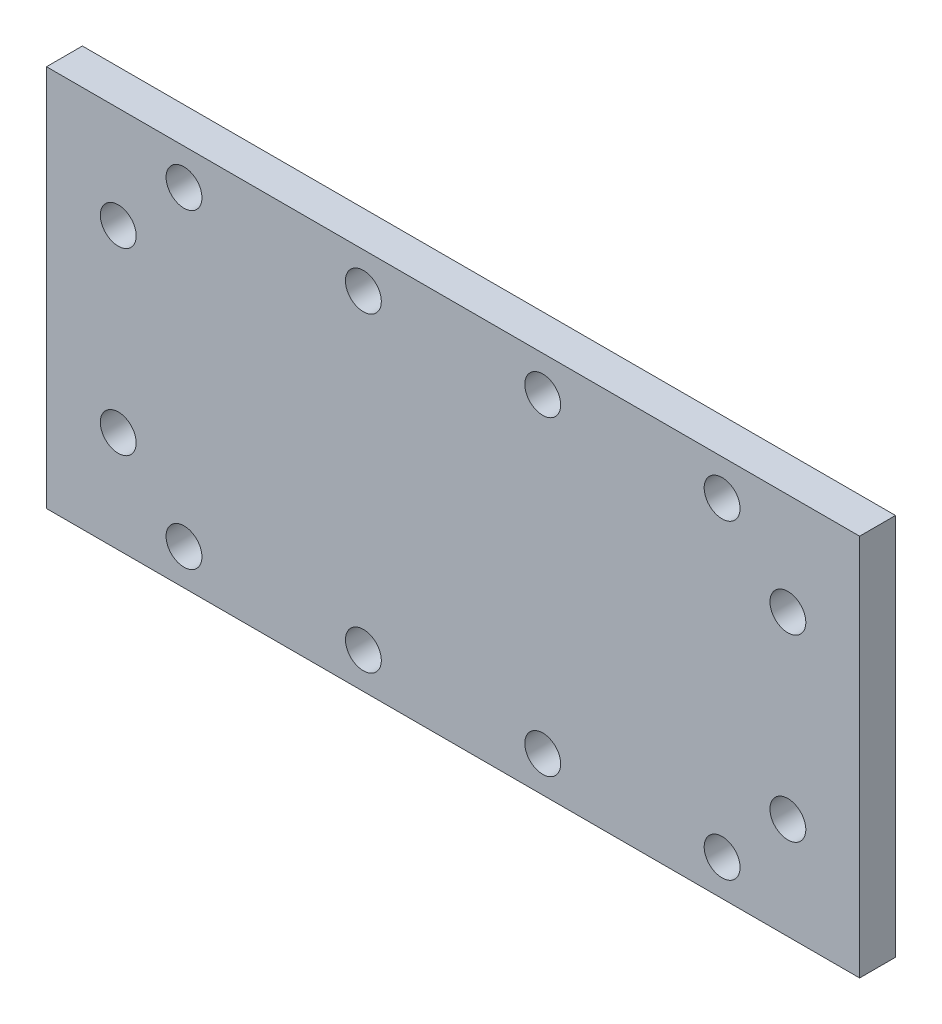
ISO-10303-21;
HEADER;
FILE_DESCRIPTION(('STEP AP214'),'2;1');
FILE_NAME('part.step','',(''),(''),'','','');
FILE_SCHEMA(('AUTOMOTIVE_DESIGN { 1 0 10303 214 1 1 1 1 }'));
ENDSEC;
DATA;
#1=APPLICATION_CONTEXT('core data for automotive mechanical design processes');
#2=APPLICATION_PROTOCOL_DEFINITION('international standard','automotive_design',2000,#1);
#3=PRODUCT_CONTEXT('',#1,'mechanical');
#4=PRODUCT('Part','Part','',(#3));
#5=PRODUCT_RELATED_PRODUCT_CATEGORY('part','',(#4));
#6=PRODUCT_DEFINITION_FORMATION('','',#4);
#7=PRODUCT_DEFINITION_CONTEXT('part definition',#1,'design');
#8=PRODUCT_DEFINITION('design','',#6,#7);
#9=PRODUCT_DEFINITION_SHAPE('','',#8);
#10=(LENGTH_UNIT() NAMED_UNIT(*) SI_UNIT(.MILLI.,.METRE.));
#11=(NAMED_UNIT(*) PLANE_ANGLE_UNIT() SI_UNIT($,.RADIAN.));
#12=(NAMED_UNIT(*) SI_UNIT($,.STERADIAN.) SOLID_ANGLE_UNIT());
#13=UNCERTAINTY_MEASURE_WITH_UNIT(LENGTH_MEASURE(1.E-05),#10,'distance_accuracy_value','');
#14=(GEOMETRIC_REPRESENTATION_CONTEXT(3) GLOBAL_UNCERTAINTY_ASSIGNED_CONTEXT((#13)) GLOBAL_UNIT_ASSIGNED_CONTEXT((#10,
#11,#12)) REPRESENTATION_CONTEXT('',''));
#15=CARTESIAN_POINT('',(0.,0.,0.));
#16=DIRECTION('',(0.,0.,1.));
#17=DIRECTION('',(1.,0.,0.));
#18=AXIS2_PLACEMENT_3D('',#15,#16,#17);
#19=CARTESIAN_POINT('',(-34.,-16.,3.));
#20=DIRECTION('',(1.,0.,0.));
#21=DIRECTION('',(0.,0.,-1.));
#22=AXIS2_PLACEMENT_3D('',#19,#20,#21);
#23=PLANE('',#22);
#24=DIRECTION('',(0.,-1.,0.));
#25=VECTOR('',#24,1.);
#26=CARTESIAN_POINT('',(-34.,-16.,0.));
#27=LINE('',#26,#25);
#28=CARTESIAN_POINT('',(-34.,16.,0.));
#29=VERTEX_POINT('',#28);
#30=CARTESIAN_POINT('',(-34.,-16.,0.));
#31=VERTEX_POINT('',#30);
#32=EDGE_CURVE('E111',#29,#31,#27,.T.);
#33=ORIENTED_EDGE('',*,*,#32,.T.);
#34=DIRECTION('',(0.,0.,-1.));
#35=VECTOR('',#34,1.);
#36=CARTESIAN_POINT('',(-34.,-16.,3.));
#37=LINE('',#36,#35);
#38=CARTESIAN_POINT('',(-34.,-16.,3.));
#39=VERTEX_POINT('',#38);
#40=EDGE_CURVE('E11',#39,#31,#37,.T.);
#41=ORIENTED_EDGE('',*,*,#40,.F.);
#42=DIRECTION('',(0.,-1.,0.));
#43=VECTOR('',#42,1.);
#44=CARTESIAN_POINT('',(-34.,-16.,3.));
#45=LINE('',#44,#43);
#46=CARTESIAN_POINT('',(-34.,16.,3.));
#47=VERTEX_POINT('',#46);
#48=EDGE_CURVE('E95',#47,#39,#45,.T.);
#49=ORIENTED_EDGE('',*,*,#48,.F.);
#50=DIRECTION('',(0.,0.,-1.));
#51=VECTOR('',#50,1.);
#52=CARTESIAN_POINT('',(-34.,16.,3.));
#53=LINE('',#52,#51);
#54=EDGE_CURVE('E107',#47,#29,#53,.T.);
#55=ORIENTED_EDGE('',*,*,#54,.T.);
#56=EDGE_LOOP('',(#33,#41,#49,#55));
#57=FACE_BOUND('',#56,.T.);
#58=ADVANCED_FACE('F43',(#57),#23,.F.);
#59=CARTESIAN_POINT('',(34.,-16.,3.));
#60=DIRECTION('',(0.,1.,0.));
#61=DIRECTION('',(-1.,0.,0.));
#62=AXIS2_PLACEMENT_3D('',#59,#60,#61);
#63=PLANE('',#62);
#64=DIRECTION('',(1.,0.,0.));
#65=VECTOR('',#64,1.);
#66=CARTESIAN_POINT('',(34.,-16.,0.));
#67=LINE('',#66,#65);
#68=CARTESIAN_POINT('',(34.,-16.,0.));
#69=VERTEX_POINT('',#68);
#70=EDGE_CURVE('E100',#31,#69,#67,.T.);
#71=ORIENTED_EDGE('',*,*,#70,.T.);
#72=DIRECTION('',(0.,0.,-1.));
#73=VECTOR('',#72,1.);
#74=CARTESIAN_POINT('',(34.,-16.,3.));
#75=LINE('',#74,#73);
#76=CARTESIAN_POINT('',(34.,-16.,3.));
#77=VERTEX_POINT('',#76);
#78=EDGE_CURVE('E52',#77,#69,#75,.T.);
#79=ORIENTED_EDGE('',*,*,#78,.F.);
#80=DIRECTION('',(1.,0.,0.));
#81=VECTOR('',#80,1.);
#82=CARTESIAN_POINT('',(34.,-16.,3.));
#83=LINE('',#82,#81);
#84=EDGE_CURVE('E90',#39,#77,#83,.T.);
#85=ORIENTED_EDGE('',*,*,#84,.F.);
#86=ORIENTED_EDGE('',*,*,#40,.T.);
#87=EDGE_LOOP('',(#71,#79,#85,#86));
#88=FACE_BOUND('',#87,.T.);
#89=ADVANCED_FACE('F99',(#88),#63,.F.);
#90=CARTESIAN_POINT('',(34.,-16.,3.));
#91=DIRECTION('',(-1.,0.,0.));
#92=DIRECTION('',(0.,0.,1.));
#93=AXIS2_PLACEMENT_3D('',#90,#91,#92);
#94=PLANE('',#93);
#95=DIRECTION('',(0.,1.,0.));
#96=VECTOR('',#95,1.);
#97=CARTESIAN_POINT('',(34.,-16.,0.));
#98=LINE('',#97,#96);
#99=CARTESIAN_POINT('',(34.,16.,0.));
#100=VERTEX_POINT('',#99);
#101=EDGE_CURVE('E77',#69,#100,#98,.T.);
#102=ORIENTED_EDGE('',*,*,#101,.T.);
#103=DIRECTION('',(0.,0.,-1.));
#104=VECTOR('',#103,1.);
#105=CARTESIAN_POINT('',(34.,16.,3.));
#106=LINE('',#105,#104);
#107=CARTESIAN_POINT('',(34.,16.,3.));
#108=VERTEX_POINT('',#107);
#109=EDGE_CURVE('E102',#108,#100,#106,.T.);
#110=ORIENTED_EDGE('',*,*,#109,.F.);
#111=DIRECTION('',(0.,1.,0.));
#112=VECTOR('',#111,1.);
#113=CARTESIAN_POINT('',(34.,-16.,3.));
#114=LINE('',#113,#112);
#115=EDGE_CURVE('E93',#77,#108,#114,.T.);
#116=ORIENTED_EDGE('',*,*,#115,.F.);
#117=ORIENTED_EDGE('',*,*,#78,.T.);
#118=EDGE_LOOP('',(#102,#110,#116,#117));
#119=FACE_BOUND('',#118,.T.);
#120=ADVANCED_FACE('F103',(#119),#94,.F.);
#121=CARTESIAN_POINT('',(34.,16.,3.));
#122=DIRECTION('',(0.,-1.,0.));
#123=DIRECTION('',(1.,0.,0.));
#124=AXIS2_PLACEMENT_3D('',#121,#122,#123);
#125=PLANE('',#124);
#126=DIRECTION('',(-1.,0.,0.));
#127=VECTOR('',#126,1.);
#128=CARTESIAN_POINT('',(34.,16.,0.));
#129=LINE('',#128,#127);
#130=EDGE_CURVE('E83',#100,#29,#129,.T.);
#131=ORIENTED_EDGE('',*,*,#130,.T.);
#132=ORIENTED_EDGE('',*,*,#54,.F.);
#133=DIRECTION('',(-1.,0.,0.));
#134=VECTOR('',#133,1.);
#135=CARTESIAN_POINT('',(34.,16.,3.));
#136=LINE('',#135,#134);
#137=EDGE_CURVE('E60',#108,#47,#136,.T.);
#138=ORIENTED_EDGE('',*,*,#137,.F.);
#139=ORIENTED_EDGE('',*,*,#109,.T.);
#140=EDGE_LOOP('',(#131,#132,#138,#139));
#141=FACE_BOUND('',#140,.T.);
#142=ADVANCED_FACE('F125',(#141),#125,.F.);
#143=CARTESIAN_POINT('',(0.,0.,3.));
#144=DIRECTION('',(0.,0.,1.));
#145=DIRECTION('',(1.,0.,0.));
#146=AXIS2_PLACEMENT_3D('',#143,#144,#145);
#147=PLANE('',#146);
#148=CARTESIAN_POINT('',(-28.,-7.5,3.));
#149=DIRECTION('',(0.,0.,1.));
#150=DIRECTION('',(1.,0.,0.));
#151=AXIS2_PLACEMENT_3D('',#148,#149,#150);
#152=CIRCLE('',#151,1.5);
#153=CARTESIAN_POINT('',(-26.5,-7.5,3.));
#154=VERTEX_POINT('',#153);
#155=EDGE_CURVE('E161',#154,#154,#152,.T.);
#156=ORIENTED_EDGE('',*,*,#155,.F.);
#157=EDGE_LOOP('',(#156));
#158=FACE_BOUND('',#157,.T.);
#159=CARTESIAN_POINT('',(22.5,-13.,3.));
#160=DIRECTION('',(0.,0.,1.));
#161=DIRECTION('',(-1.,0.,0.));
#162=AXIS2_PLACEMENT_3D('',#159,#160,#161);
#163=CIRCLE('',#162,1.5);
#164=CARTESIAN_POINT('',(21.,-13.,3.));
#165=VERTEX_POINT('',#164);
#166=EDGE_CURVE('E176',#165,#165,#163,.T.);
#167=ORIENTED_EDGE('',*,*,#166,.F.);
#168=EDGE_LOOP('',(#167));
#169=FACE_BOUND('',#168,.T.);
#170=CARTESIAN_POINT('',(7.49999999999999,-13.,3.));
#171=DIRECTION('',(0.,0.,1.));
#172=DIRECTION('',(-1.,0.,0.));
#173=AXIS2_PLACEMENT_3D('',#170,#171,#172);
#174=CIRCLE('',#173,1.5);
#175=CARTESIAN_POINT('',(5.99999999999999,-13.,3.));
#176=VERTEX_POINT('',#175);
#177=EDGE_CURVE('E177',#176,#176,#174,.T.);
#178=ORIENTED_EDGE('',*,*,#177,.F.);
#179=EDGE_LOOP('',(#178));
#180=FACE_BOUND('',#179,.T.);
#181=CARTESIAN_POINT('',(-7.50000000000001,-13.,3.));
#182=DIRECTION('',(0.,0.,1.));
#183=DIRECTION('',(-1.,0.,0.));
#184=AXIS2_PLACEMENT_3D('',#181,#182,#183);
#185=CIRCLE('',#184,1.5);
#186=CARTESIAN_POINT('',(-9.00000000000001,-13.,3.));
#187=VERTEX_POINT('',#186);
#188=EDGE_CURVE('E192',#187,#187,#185,.T.);
#189=ORIENTED_EDGE('',*,*,#188,.F.);
#190=EDGE_LOOP('',(#189));
#191=FACE_BOUND('',#190,.T.);
#192=CARTESIAN_POINT('',(-7.50000000000001,13.,3.));
#193=DIRECTION('',(0.,0.,1.));
#194=DIRECTION('',(1.,0.,0.));
#195=AXIS2_PLACEMENT_3D('',#192,#193,#194);
#196=CIRCLE('',#195,1.5);
#197=CARTESIAN_POINT('',(-6.00000000000001,13.,3.));
#198=VERTEX_POINT('',#197);
#199=EDGE_CURVE('E136',#198,#198,#196,.T.);
#200=ORIENTED_EDGE('',*,*,#199,.F.);
#201=EDGE_LOOP('',(#200));
#202=FACE_BOUND('',#201,.T.);
#203=CARTESIAN_POINT('',(7.49999999999999,13.,3.));
#204=DIRECTION('',(0.,0.,1.));
#205=DIRECTION('',(1.,0.,0.));
#206=AXIS2_PLACEMENT_3D('',#203,#204,#205);
#207=CIRCLE('',#206,1.5);
#208=CARTESIAN_POINT('',(8.99999999999999,13.,3.));
#209=VERTEX_POINT('',#208);
#210=EDGE_CURVE('E144',#209,#209,#207,.T.);
#211=ORIENTED_EDGE('',*,*,#210,.F.);
#212=EDGE_LOOP('',(#211));
#213=FACE_BOUND('',#212,.T.);
#214=CARTESIAN_POINT('',(22.5,13.,3.));
#215=DIRECTION('',(0.,0.,1.));
#216=DIRECTION('',(1.,0.,0.));
#217=AXIS2_PLACEMENT_3D('',#214,#215,#216);
#218=CIRCLE('',#217,1.5);
#219=CARTESIAN_POINT('',(24.,13.,3.));
#220=VERTEX_POINT('',#219);
#221=EDGE_CURVE('E145',#220,#220,#218,.T.);
#222=ORIENTED_EDGE('',*,*,#221,.F.);
#223=EDGE_LOOP('',(#222));
#224=FACE_BOUND('',#223,.T.);
#225=CARTESIAN_POINT('',(-22.5,-13.,3.));
#226=DIRECTION('',(0.,0.,1.));
#227=DIRECTION('',(-1.,0.,0.));
#228=AXIS2_PLACEMENT_3D('',#225,#226,#227);
#229=CIRCLE('',#228,1.5);
#230=CARTESIAN_POINT('',(-24.,-13.,3.));
#231=VERTEX_POINT('',#230);
#232=EDGE_CURVE('E160',#231,#231,#229,.T.);
#233=ORIENTED_EDGE('',*,*,#232,.F.);
#234=EDGE_LOOP('',(#233));
#235=FACE_BOUND('',#234,.T.);
#236=CARTESIAN_POINT('',(28.,7.49999999999999,3.));
#237=DIRECTION('',(0.,0.,1.));
#238=DIRECTION('',(-1.,0.,0.));
#239=AXIS2_PLACEMENT_3D('',#236,#237,#238);
#240=CIRCLE('',#239,1.5);
#241=CARTESIAN_POINT('',(26.5,7.49999999999999,3.));
#242=VERTEX_POINT('',#241);
#243=EDGE_CURVE('E209',#242,#242,#240,.T.);
#244=ORIENTED_EDGE('',*,*,#243,.F.);
#245=EDGE_LOOP('',(#244));
#246=FACE_BOUND('',#245,.T.);
#247=CARTESIAN_POINT('',(28.,-7.5,3.));
#248=DIRECTION('',(0.,0.,1.));
#249=DIRECTION('',(-1.,0.,0.));
#250=AXIS2_PLACEMENT_3D('',#247,#248,#249);
#251=CIRCLE('',#250,1.5);
#252=CARTESIAN_POINT('',(26.5,-7.5,3.));
#253=VERTEX_POINT('',#252);
#254=EDGE_CURVE('E208',#253,#253,#251,.T.);
#255=ORIENTED_EDGE('',*,*,#254,.F.);
#256=EDGE_LOOP('',(#255));
#257=FACE_BOUND('',#256,.T.);
#258=CARTESIAN_POINT('',(-28.,7.49999999999999,3.));
#259=DIRECTION('',(0.,0.,1.));
#260=DIRECTION('',(1.,0.,0.));
#261=AXIS2_PLACEMENT_3D('',#258,#259,#260);
#262=CIRCLE('',#261,1.5);
#263=CARTESIAN_POINT('',(-26.5,7.49999999999999,3.));
#264=VERTEX_POINT('',#263);
#265=EDGE_CURVE('E193',#264,#264,#262,.T.);
#266=ORIENTED_EDGE('',*,*,#265,.F.);
#267=EDGE_LOOP('',(#266));
#268=FACE_BOUND('',#267,.T.);
#269=CARTESIAN_POINT('',(-22.5,13.,3.));
#270=DIRECTION('',(0.,0.,1.));
#271=DIRECTION('',(1.,0.,0.));
#272=AXIS2_PLACEMENT_3D('',#269,#270,#271);
#273=CIRCLE('',#272,1.5);
#274=CARTESIAN_POINT('',(-21.,13.,3.));
#275=VERTEX_POINT('',#274);
#276=EDGE_CURVE('E132',#275,#275,#273,.T.);
#277=ORIENTED_EDGE('',*,*,#276,.F.);
#278=EDGE_LOOP('',(#277));
#279=FACE_BOUND('',#278,.T.);
#280=ORIENTED_EDGE('',*,*,#48,.T.);
#281=ORIENTED_EDGE('',*,*,#84,.T.);
#282=ORIENTED_EDGE('',*,*,#115,.T.);
#283=ORIENTED_EDGE('',*,*,#137,.T.);
#284=EDGE_LOOP('',(#280,#281,#282,#283));
#285=FACE_BOUND('',#284,.T.);
#286=ADVANCED_FACE('F91',(#158,#169,#180,#191,#202,#213,#224,#235,#246,#257,#268,#279,#285),
#147,.T.);
#287=CARTESIAN_POINT('',(0.,0.,0.));
#288=DIRECTION('',(0.,0.,1.));
#289=DIRECTION('',(1.,0.,0.));
#290=AXIS2_PLACEMENT_3D('',#287,#288,#289);
#291=PLANE('',#290);
#292=CARTESIAN_POINT('',(-28.,-7.5,0.));
#293=DIRECTION('',(0.,0.,1.));
#294=DIRECTION('',(1.,0.,0.));
#295=AXIS2_PLACEMENT_3D('',#292,#293,#294);
#296=CIRCLE('',#295,1.5);
#297=CARTESIAN_POINT('',(-26.5,-7.5,0.));
#298=VERTEX_POINT('',#297);
#299=EDGE_CURVE('E181',#298,#298,#296,.T.);
#300=ORIENTED_EDGE('',*,*,#299,.T.);
#301=EDGE_LOOP('',(#300));
#302=FACE_BOUND('',#301,.T.);
#303=CARTESIAN_POINT('',(22.5,-13.,0.));
#304=DIRECTION('',(0.,0.,1.));
#305=DIRECTION('',(-1.,0.,0.));
#306=AXIS2_PLACEMENT_3D('',#303,#304,#305);
#307=CIRCLE('',#306,1.5);
#308=CARTESIAN_POINT('',(21.,-13.,0.));
#309=VERTEX_POINT('',#308);
#310=EDGE_CURVE('E172',#309,#309,#307,.T.);
#311=ORIENTED_EDGE('',*,*,#310,.T.);
#312=EDGE_LOOP('',(#311));
#313=FACE_BOUND('',#312,.T.);
#314=CARTESIAN_POINT('',(7.49999999999999,-13.,0.));
#315=DIRECTION('',(0.,0.,1.));
#316=DIRECTION('',(-1.,0.,0.));
#317=AXIS2_PLACEMENT_3D('',#314,#315,#316);
#318=CIRCLE('',#317,1.5);
#319=CARTESIAN_POINT('',(5.99999999999999,-13.,0.));
#320=VERTEX_POINT('',#319);
#321=EDGE_CURVE('E197',#320,#320,#318,.T.);
#322=ORIENTED_EDGE('',*,*,#321,.T.);
#323=EDGE_LOOP('',(#322));
#324=FACE_BOUND('',#323,.T.);
#325=CARTESIAN_POINT('',(-7.50000000000001,-13.,0.));
#326=DIRECTION('',(0.,0.,1.));
#327=DIRECTION('',(-1.,0.,0.));
#328=AXIS2_PLACEMENT_3D('',#325,#326,#327);
#329=CIRCLE('',#328,1.5);
#330=CARTESIAN_POINT('',(-9.00000000000001,-13.,0.));
#331=VERTEX_POINT('',#330);
#332=EDGE_CURVE('E188',#331,#331,#329,.T.);
#333=ORIENTED_EDGE('',*,*,#332,.T.);
#334=EDGE_LOOP('',(#333));
#335=FACE_BOUND('',#334,.T.);
#336=CARTESIAN_POINT('',(-7.50000000000001,13.,0.));
#337=DIRECTION('',(0.,0.,1.));
#338=DIRECTION('',(1.,0.,0.));
#339=AXIS2_PLACEMENT_3D('',#336,#337,#338);
#340=CIRCLE('',#339,1.5);
#341=CARTESIAN_POINT('',(-6.00000000000001,13.,0.));
#342=VERTEX_POINT('',#341);
#343=EDGE_CURVE('E149',#342,#342,#340,.T.);
#344=ORIENTED_EDGE('',*,*,#343,.T.);
#345=EDGE_LOOP('',(#344));
#346=FACE_BOUND('',#345,.T.);
#347=CARTESIAN_POINT('',(7.49999999999999,13.,0.));
#348=DIRECTION('',(0.,0.,1.));
#349=DIRECTION('',(1.,0.,0.));
#350=AXIS2_PLACEMENT_3D('',#347,#348,#349);
#351=CIRCLE('',#350,1.5);
#352=CARTESIAN_POINT('',(8.99999999999999,13.,0.));
#353=VERTEX_POINT('',#352);
#354=EDGE_CURVE('E140',#353,#353,#351,.T.);
#355=ORIENTED_EDGE('',*,*,#354,.T.);
#356=EDGE_LOOP('',(#355));
#357=FACE_BOUND('',#356,.T.);
#358=CARTESIAN_POINT('',(22.5,13.,0.));
#359=DIRECTION('',(0.,0.,1.));
#360=DIRECTION('',(1.,0.,0.));
#361=AXIS2_PLACEMENT_3D('',#358,#359,#360);
#362=CIRCLE('',#361,1.5);
#363=CARTESIAN_POINT('',(24.,13.,0.));
#364=VERTEX_POINT('',#363);
#365=EDGE_CURVE('E165',#364,#364,#362,.T.);
#366=ORIENTED_EDGE('',*,*,#365,.T.);
#367=EDGE_LOOP('',(#366));
#368=FACE_BOUND('',#367,.T.);
#369=CARTESIAN_POINT('',(-22.5,-13.,0.));
#370=DIRECTION('',(0.,0.,1.));
#371=DIRECTION('',(-1.,0.,0.));
#372=AXIS2_PLACEMENT_3D('',#369,#370,#371);
#373=CIRCLE('',#372,1.5);
#374=CARTESIAN_POINT('',(-24.,-13.,0.));
#375=VERTEX_POINT('',#374);
#376=EDGE_CURVE('E156',#375,#375,#373,.T.);
#377=ORIENTED_EDGE('',*,*,#376,.T.);
#378=EDGE_LOOP('',(#377));
#379=FACE_BOUND('',#378,.T.);
#380=CARTESIAN_POINT('',(28.,7.49999999999999,0.));
#381=DIRECTION('',(0.,0.,1.));
#382=DIRECTION('',(-1.,0.,0.));
#383=AXIS2_PLACEMENT_3D('',#380,#381,#382);
#384=CIRCLE('',#383,1.5);
#385=CARTESIAN_POINT('',(26.5,7.49999999999999,0.));
#386=VERTEX_POINT('',#385);
#387=EDGE_CURVE('E220',#386,#386,#384,.T.);
#388=ORIENTED_EDGE('',*,*,#387,.T.);
#389=EDGE_LOOP('',(#388));
#390=FACE_BOUND('',#389,.T.);
#391=CARTESIAN_POINT('',(28.,-7.5,0.));
#392=DIRECTION('',(0.,0.,1.));
#393=DIRECTION('',(-1.,0.,0.));
#394=AXIS2_PLACEMENT_3D('',#391,#392,#393);
#395=CIRCLE('',#394,1.5);
#396=CARTESIAN_POINT('',(26.5,-7.5,0.));
#397=VERTEX_POINT('',#396);
#398=EDGE_CURVE('E204',#397,#397,#395,.T.);
#399=ORIENTED_EDGE('',*,*,#398,.T.);
#400=EDGE_LOOP('',(#399));
#401=FACE_BOUND('',#400,.T.);
#402=CARTESIAN_POINT('',(-28.,7.49999999999999,0.));
#403=DIRECTION('',(0.,0.,1.));
#404=DIRECTION('',(1.,0.,0.));
#405=AXIS2_PLACEMENT_3D('',#402,#403,#404);
#406=CIRCLE('',#405,1.5);
#407=CARTESIAN_POINT('',(-26.5,7.49999999999999,0.));
#408=VERTEX_POINT('',#407);
#409=EDGE_CURVE('E213',#408,#408,#406,.T.);
#410=ORIENTED_EDGE('',*,*,#409,.T.);
#411=EDGE_LOOP('',(#410));
#412=FACE_BOUND('',#411,.T.);
#413=CARTESIAN_POINT('',(-22.5,13.,0.));
#414=DIRECTION('',(0.,0.,1.));
#415=DIRECTION('',(1.,0.,0.));
#416=AXIS2_PLACEMENT_3D('',#413,#414,#415);
#417=CIRCLE('',#416,1.5);
#418=CARTESIAN_POINT('',(-21.,13.,0.));
#419=VERTEX_POINT('',#418);
#420=EDGE_CURVE('E115',#419,#419,#417,.T.);
#421=ORIENTED_EDGE('',*,*,#420,.T.);
#422=EDGE_LOOP('',(#421));
#423=FACE_BOUND('',#422,.T.);
#424=ORIENTED_EDGE('',*,*,#32,.F.);
#425=ORIENTED_EDGE('',*,*,#130,.F.);
#426=ORIENTED_EDGE('',*,*,#101,.F.);
#427=ORIENTED_EDGE('',*,*,#70,.F.);
#428=EDGE_LOOP('',(#424,#425,#426,#427));
#429=FACE_BOUND('',#428,.T.);
#430=ADVANCED_FACE('F128',(#302,#313,#324,#335,#346,#357,#368,#379,#390,#401,#412,#423,#429),
#291,.F.);
#431=CARTESIAN_POINT('',(-22.5,13.,0.));
#432=DIRECTION('',(0.,0.,1.));
#433=DIRECTION('',(1.,0.,0.));
#434=AXIS2_PLACEMENT_3D('',#431,#432,#433);
#435=CYLINDRICAL_SURFACE('',#434,1.5);
#436=ORIENTED_EDGE('',*,*,#420,.F.);
#437=EDGE_LOOP('',(#436));
#438=FACE_BOUND('',#437,.T.);
#439=ORIENTED_EDGE('',*,*,#276,.T.);
#440=EDGE_LOOP('',(#439));
#441=FACE_BOUND('',#440,.T.);
#442=ADVANCED_FACE('F240',(#438,#441),#435,.F.);
#443=CARTESIAN_POINT('',(-28.,7.49999999999999,0.));
#444=DIRECTION('',(0.,0.,1.));
#445=DIRECTION('',(1.,0.,0.));
#446=AXIS2_PLACEMENT_3D('',#443,#444,#445);
#447=CYLINDRICAL_SURFACE('',#446,1.5);
#448=ORIENTED_EDGE('',*,*,#409,.F.);
#449=EDGE_LOOP('',(#448));
#450=FACE_BOUND('',#449,.T.);
#451=ORIENTED_EDGE('',*,*,#265,.T.);
#452=EDGE_LOOP('',(#451));
#453=FACE_BOUND('',#452,.T.);
#454=ADVANCED_FACE('F242',(#450,#453),#447,.F.);
#455=CARTESIAN_POINT('',(28.,-7.5,0.));
#456=DIRECTION('',(0.,0.,1.));
#457=DIRECTION('',(1.,0.,0.));
#458=AXIS2_PLACEMENT_3D('',#455,#456,#457);
#459=CYLINDRICAL_SURFACE('',#458,1.5);
#460=ORIENTED_EDGE('',*,*,#398,.F.);
#461=EDGE_LOOP('',(#460));
#462=FACE_BOUND('',#461,.T.);
#463=ORIENTED_EDGE('',*,*,#254,.T.);
#464=EDGE_LOOP('',(#463));
#465=FACE_BOUND('',#464,.T.);
#466=ADVANCED_FACE('F249',(#462,#465),#459,.F.);
#467=CARTESIAN_POINT('',(28.,7.49999999999999,0.));
#468=DIRECTION('',(0.,0.,1.));
#469=DIRECTION('',(1.,0.,0.));
#470=AXIS2_PLACEMENT_3D('',#467,#468,#469);
#471=CYLINDRICAL_SURFACE('',#470,1.5);
#472=ORIENTED_EDGE('',*,*,#387,.F.);
#473=EDGE_LOOP('',(#472));
#474=FACE_BOUND('',#473,.T.);
#475=ORIENTED_EDGE('',*,*,#243,.T.);
#476=EDGE_LOOP('',(#475));
#477=FACE_BOUND('',#476,.T.);
#478=ADVANCED_FACE('F228',(#474,#477),#471,.F.);
#479=CARTESIAN_POINT('',(-22.5,-13.,0.));
#480=DIRECTION('',(0.,0.,1.));
#481=DIRECTION('',(1.,0.,0.));
#482=AXIS2_PLACEMENT_3D('',#479,#480,#481);
#483=CYLINDRICAL_SURFACE('',#482,1.5);
#484=ORIENTED_EDGE('',*,*,#376,.F.);
#485=EDGE_LOOP('',(#484));
#486=FACE_BOUND('',#485,.T.);
#487=ORIENTED_EDGE('',*,*,#232,.T.);
#488=EDGE_LOOP('',(#487));
#489=FACE_BOUND('',#488,.T.);
#490=ADVANCED_FACE('F310',(#486,#489),#483,.F.);
#491=CARTESIAN_POINT('',(22.5,13.,0.));
#492=DIRECTION('',(0.,0.,1.));
#493=DIRECTION('',(1.,0.,0.));
#494=AXIS2_PLACEMENT_3D('',#491,#492,#493);
#495=CYLINDRICAL_SURFACE('',#494,1.5);
#496=ORIENTED_EDGE('',*,*,#365,.F.);
#497=EDGE_LOOP('',(#496));
#498=FACE_BOUND('',#497,.T.);
#499=ORIENTED_EDGE('',*,*,#221,.T.);
#500=EDGE_LOOP('',(#499));
#501=FACE_BOUND('',#500,.T.);
#502=ADVANCED_FACE('F321',(#498,#501),#495,.F.);
#503=CARTESIAN_POINT('',(7.49999999999999,13.,0.));
#504=DIRECTION('',(0.,0.,1.));
#505=DIRECTION('',(1.,0.,0.));
#506=AXIS2_PLACEMENT_3D('',#503,#504,#505);
#507=CYLINDRICAL_SURFACE('',#506,1.5);
#508=ORIENTED_EDGE('',*,*,#354,.F.);
#509=EDGE_LOOP('',(#508));
#510=FACE_BOUND('',#509,.T.);
#511=ORIENTED_EDGE('',*,*,#210,.T.);
#512=EDGE_LOOP('',(#511));
#513=FACE_BOUND('',#512,.T.);
#514=ADVANCED_FACE('F332',(#510,#513),#507,.F.);
#515=CARTESIAN_POINT('',(-7.50000000000001,13.,0.));
#516=DIRECTION('',(0.,0.,1.));
#517=DIRECTION('',(1.,0.,0.));
#518=AXIS2_PLACEMENT_3D('',#515,#516,#517);
#519=CYLINDRICAL_SURFACE('',#518,1.5);
#520=ORIENTED_EDGE('',*,*,#343,.F.);
#521=EDGE_LOOP('',(#520));
#522=FACE_BOUND('',#521,.T.);
#523=ORIENTED_EDGE('',*,*,#199,.T.);
#524=EDGE_LOOP('',(#523));
#525=FACE_BOUND('',#524,.T.);
#526=ADVANCED_FACE('F343',(#522,#525),#519,.F.);
#527=CARTESIAN_POINT('',(-7.50000000000001,-13.,0.));
#528=DIRECTION('',(0.,0.,1.));
#529=DIRECTION('',(1.,0.,0.));
#530=AXIS2_PLACEMENT_3D('',#527,#528,#529);
#531=CYLINDRICAL_SURFACE('',#530,1.5);
#532=ORIENTED_EDGE('',*,*,#332,.F.);
#533=EDGE_LOOP('',(#532));
#534=FACE_BOUND('',#533,.T.);
#535=ORIENTED_EDGE('',*,*,#188,.T.);
#536=EDGE_LOOP('',(#535));
#537=FACE_BOUND('',#536,.T.);
#538=ADVANCED_FACE('F353',(#534,#537),#531,.F.);
#539=CARTESIAN_POINT('',(7.49999999999999,-13.,0.));
#540=DIRECTION('',(0.,0.,1.));
#541=DIRECTION('',(1.,0.,0.));
#542=AXIS2_PLACEMENT_3D('',#539,#540,#541);
#543=CYLINDRICAL_SURFACE('',#542,1.5);
#544=ORIENTED_EDGE('',*,*,#321,.F.);
#545=EDGE_LOOP('',(#544));
#546=FACE_BOUND('',#545,.T.);
#547=ORIENTED_EDGE('',*,*,#177,.T.);
#548=EDGE_LOOP('',(#547));
#549=FACE_BOUND('',#548,.T.);
#550=ADVANCED_FACE('F364',(#546,#549),#543,.F.);
#551=CARTESIAN_POINT('',(22.5,-13.,0.));
#552=DIRECTION('',(0.,0.,1.));
#553=DIRECTION('',(1.,0.,0.));
#554=AXIS2_PLACEMENT_3D('',#551,#552,#553);
#555=CYLINDRICAL_SURFACE('',#554,1.5);
#556=ORIENTED_EDGE('',*,*,#310,.F.);
#557=EDGE_LOOP('',(#556));
#558=FACE_BOUND('',#557,.T.);
#559=ORIENTED_EDGE('',*,*,#166,.T.);
#560=EDGE_LOOP('',(#559));
#561=FACE_BOUND('',#560,.T.);
#562=ADVANCED_FACE('F375',(#558,#561),#555,.F.);
#563=CARTESIAN_POINT('',(-28.,-7.5,0.));
#564=DIRECTION('',(0.,0.,1.));
#565=DIRECTION('',(1.,0.,0.));
#566=AXIS2_PLACEMENT_3D('',#563,#564,#565);
#567=CYLINDRICAL_SURFACE('',#566,1.5);
#568=ORIENTED_EDGE('',*,*,#299,.F.);
#569=EDGE_LOOP('',(#568));
#570=FACE_BOUND('',#569,.T.);
#571=ORIENTED_EDGE('',*,*,#155,.T.);
#572=EDGE_LOOP('',(#571));
#573=FACE_BOUND('',#572,.T.);
#574=ADVANCED_FACE('F386',(#570,#573),#567,.F.);
#575=CLOSED_SHELL('',(#58,#89,#120,#142,#286,#430,#442,#454,#466,#478,#490,#502,#514,#526,#538,
#550,#562,#574));
#576=MANIFOLD_SOLID_BREP('B2',#575);
#577=ADVANCED_BREP_SHAPE_REPRESENTATION('',(#18,#576),#14);
#578=SHAPE_DEFINITION_REPRESENTATION(#9,#577);
ENDSEC;
END-ISO-10303-21;
